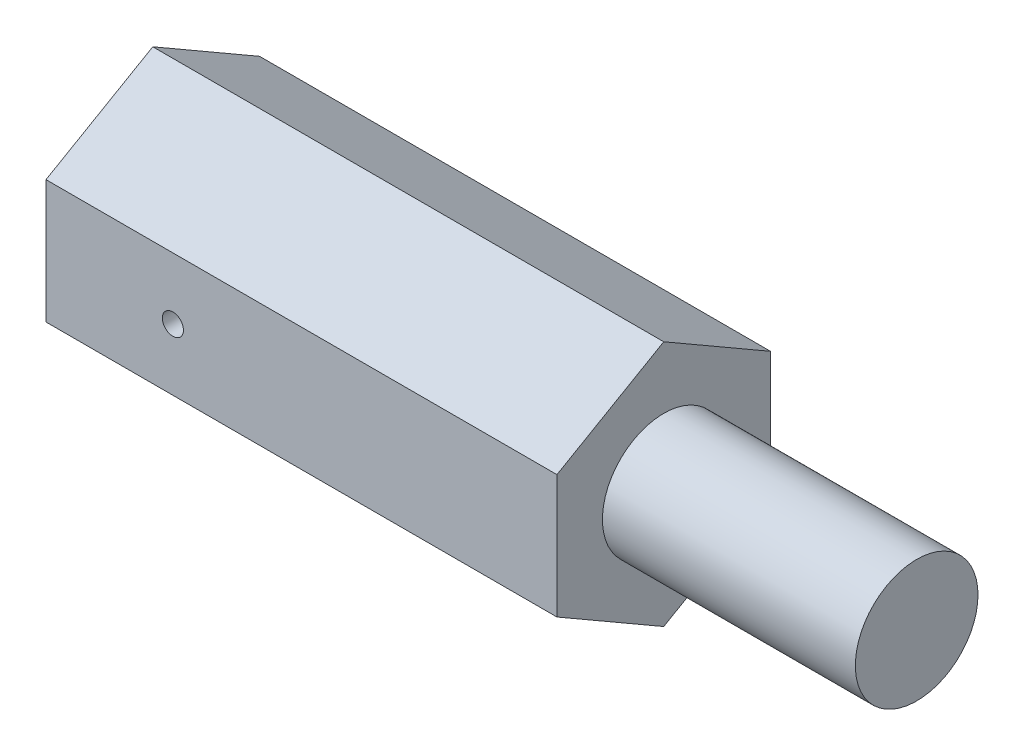
ISO-10303-21;
HEADER;
FILE_DESCRIPTION(('STEP AP214'),'2;1');
FILE_NAME('part.step','',(''),(''),'','','');
FILE_SCHEMA(('AUTOMOTIVE_DESIGN { 1 0 10303 214 1 1 1 1 }'));
ENDSEC;
DATA;
#1=APPLICATION_CONTEXT('core data for automotive mechanical design processes');
#2=APPLICATION_PROTOCOL_DEFINITION('international standard','automotive_design',2000,#1);
#3=PRODUCT_CONTEXT('',#1,'mechanical');
#4=PRODUCT('Part','Part','',(#3));
#5=PRODUCT_RELATED_PRODUCT_CATEGORY('part','',(#4));
#6=PRODUCT_DEFINITION_FORMATION('','',#4);
#7=PRODUCT_DEFINITION_CONTEXT('part definition',#1,'design');
#8=PRODUCT_DEFINITION('design','',#6,#7);
#9=PRODUCT_DEFINITION_SHAPE('','',#8);
#10=(LENGTH_UNIT() NAMED_UNIT(*) SI_UNIT(.MILLI.,.METRE.));
#11=(NAMED_UNIT(*) PLANE_ANGLE_UNIT() SI_UNIT($,.RADIAN.));
#12=(NAMED_UNIT(*) SI_UNIT($,.STERADIAN.) SOLID_ANGLE_UNIT());
#13=UNCERTAINTY_MEASURE_WITH_UNIT(LENGTH_MEASURE(1.E-05),#10,'distance_accuracy_value','');
#14=(GEOMETRIC_REPRESENTATION_CONTEXT(3) GLOBAL_UNCERTAINTY_ASSIGNED_CONTEXT((#13)) GLOBAL_UNIT_ASSIGNED_CONTEXT((#10,
#11,#12)) REPRESENTATION_CONTEXT('',''));
#15=CARTESIAN_POINT('',(0.,0.,0.));
#16=DIRECTION('',(0.,0.,1.));
#17=DIRECTION('',(1.,0.,0.));
#18=AXIS2_PLACEMENT_3D('',#15,#16,#17);
#19=CARTESIAN_POINT('',(0.,0.,0.));
#20=DIRECTION('',(1.,0.,0.));
#21=DIRECTION('',(0.,0.,-1.));
#22=AXIS2_PLACEMENT_3D('',#19,#20,#21);
#23=PLANE('',#22);
#24=DIRECTION('',(0.,0.5,0.866025403784439));
#25=VECTOR('',#24,1.);
#26=CARTESIAN_POINT('',(0.,1.45780942970381,-2.52499999999999));
#27=LINE('',#26,#25);
#28=CARTESIAN_POINT('',(0.,1.45780942970381,-2.52499999999999));
#29=VERTEX_POINT('',#28);
#30=CARTESIAN_POINT('',(0.,2.91561885940761,0.));
#31=VERTEX_POINT('',#30);
#32=EDGE_CURVE('E126',#29,#31,#27,.T.);
#33=ORIENTED_EDGE('',*,*,#32,.F.);
#34=DIRECTION('',(0.,1.,0.));
#35=VECTOR('',#34,1.);
#36=CARTESIAN_POINT('',(0.,-1.45780942970381,-2.52499999999999));
#37=LINE('',#36,#35);
#38=CARTESIAN_POINT('',(0.,-1.45780942970381,-2.52499999999999));
#39=VERTEX_POINT('',#38);
#40=EDGE_CURVE('E85',#39,#29,#37,.T.);
#41=ORIENTED_EDGE('',*,*,#40,.F.);
#42=DIRECTION('',(0.,0.5,-0.866025403784439));
#43=VECTOR('',#42,1.);
#44=CARTESIAN_POINT('',(0.,-2.91561885940762,0.));
#45=LINE('',#44,#43);
#46=CARTESIAN_POINT('',(0.,-2.91561885940762,0.));
#47=VERTEX_POINT('',#46);
#48=EDGE_CURVE('E79',#47,#39,#45,.T.);
#49=ORIENTED_EDGE('',*,*,#48,.F.);
#50=DIRECTION('',(0.,-0.5,-0.866025403784439));
#51=VECTOR('',#50,1.);
#52=CARTESIAN_POINT('',(0.,-1.45780942970381,2.52500000000001));
#53=LINE('',#52,#51);
#54=CARTESIAN_POINT('',(0.,-1.45780942970381,2.52500000000001));
#55=VERTEX_POINT('',#54);
#56=EDGE_CURVE('E116',#55,#47,#53,.T.);
#57=ORIENTED_EDGE('',*,*,#56,.F.);
#58=DIRECTION('',(0.,-1.,0.));
#59=VECTOR('',#58,1.);
#60=CARTESIAN_POINT('',(0.,1.4578094297038,2.52500000000001));
#61=LINE('',#60,#59);
#62=CARTESIAN_POINT('',(0.,1.4578094297038,2.52500000000001));
#63=VERTEX_POINT('',#62);
#64=EDGE_CURVE('E132',#63,#55,#61,.T.);
#65=ORIENTED_EDGE('',*,*,#64,.F.);
#66=DIRECTION('',(0.,-0.5,0.866025403784438));
#67=VECTOR('',#66,1.);
#68=CARTESIAN_POINT('',(0.,2.91561885940761,0.));
#69=LINE('',#68,#67);
#70=EDGE_CURVE('E129',#31,#63,#69,.T.);
#71=ORIENTED_EDGE('',*,*,#70,.F.);
#72=EDGE_LOOP('',(#33,#41,#49,#57,#65,#71));
#73=FACE_BOUND('',#72,.T.);
#74=CARTESIAN_POINT('',(0.,0.,0.));
#75=DIRECTION('',(-1.,0.,0.));
#76=DIRECTION('',(0.,0.,1.));
#77=AXIS2_PLACEMENT_3D('',#74,#75,#76);
#78=CIRCLE('',#77,2.);
#79=CARTESIAN_POINT('',(0.,0.,2.));
#80=VERTEX_POINT('',#79);
#81=EDGE_CURVE('E209',#80,#80,#78,.T.);
#82=ORIENTED_EDGE('',*,*,#81,.F.);
#83=EDGE_LOOP('',(#82));
#84=FACE_BOUND('',#83,.T.);
#85=ADVANCED_FACE('F38',(#73,#84),#23,.F.);
#86=CARTESIAN_POINT('',(12.08,0.,0.));
#87=DIRECTION('',(1.,0.,0.));
#88=DIRECTION('',(0.,0.,-1.));
#89=AXIS2_PLACEMENT_3D('',#86,#87,#88);
#90=PLANE('',#89);
#91=DIRECTION('',(0.,0.5,0.866025403784439));
#92=VECTOR('',#91,1.);
#93=CARTESIAN_POINT('',(12.08,1.45780942970381,-2.52499999999999));
#94=LINE('',#93,#92);
#95=CARTESIAN_POINT('',(12.08,1.45780942970381,-2.52499999999999));
#96=VERTEX_POINT('',#95);
#97=CARTESIAN_POINT('',(12.08,2.91561885940761,0.));
#98=VERTEX_POINT('',#97);
#99=EDGE_CURVE('E137',#96,#98,#94,.T.);
#100=ORIENTED_EDGE('',*,*,#99,.T.);
#101=DIRECTION('',(0.,-0.5,0.866025403784438));
#102=VECTOR('',#101,1.);
#103=CARTESIAN_POINT('',(12.08,2.91561885940761,0.));
#104=LINE('',#103,#102);
#105=CARTESIAN_POINT('',(12.08,1.4578094297038,2.52500000000001));
#106=VERTEX_POINT('',#105);
#107=EDGE_CURVE('E93',#98,#106,#104,.T.);
#108=ORIENTED_EDGE('',*,*,#107,.T.);
#109=DIRECTION('',(0.,-1.,0.));
#110=VECTOR('',#109,1.);
#111=CARTESIAN_POINT('',(12.08,1.4578094297038,2.52500000000001));
#112=LINE('',#111,#110);
#113=CARTESIAN_POINT('',(12.08,-1.45780942970381,2.52500000000001));
#114=VERTEX_POINT('',#113);
#115=EDGE_CURVE('E108',#106,#114,#112,.T.);
#116=ORIENTED_EDGE('',*,*,#115,.T.);
#117=DIRECTION('',(0.,-0.5,-0.866025403784439));
#118=VECTOR('',#117,1.);
#119=CARTESIAN_POINT('',(12.08,-1.45780942970381,2.52500000000001));
#120=LINE('',#119,#118);
#121=CARTESIAN_POINT('',(12.08,-2.91561885940762,0.));
#122=VERTEX_POINT('',#121);
#123=EDGE_CURVE('E101',#114,#122,#120,.T.);
#124=ORIENTED_EDGE('',*,*,#123,.T.);
#125=DIRECTION('',(0.,0.5,-0.866025403784439));
#126=VECTOR('',#125,1.);
#127=CARTESIAN_POINT('',(12.08,-2.91561885940762,0.));
#128=LINE('',#127,#126);
#129=CARTESIAN_POINT('',(12.08,-1.45780942970381,-2.52499999999999));
#130=VERTEX_POINT('',#129);
#131=EDGE_CURVE('E106',#122,#130,#128,.T.);
#132=ORIENTED_EDGE('',*,*,#131,.T.);
#133=DIRECTION('',(0.,1.,0.));
#134=VECTOR('',#133,1.);
#135=CARTESIAN_POINT('',(12.08,-1.45780942970381,-2.52499999999999));
#136=LINE('',#135,#134);
#137=EDGE_CURVE('E55',#130,#96,#136,.T.);
#138=ORIENTED_EDGE('',*,*,#137,.T.);
#139=EDGE_LOOP('',(#100,#108,#116,#124,#132,#138));
#140=FACE_BOUND('',#139,.T.);
#141=CARTESIAN_POINT('',(12.08,0.,0.));
#142=DIRECTION('',(1.,0.,0.));
#143=DIRECTION('',(0.,0.,-1.));
#144=AXIS2_PLACEMENT_3D('',#141,#142,#143);
#145=CIRCLE('',#144,1.45);
#146=CARTESIAN_POINT('',(12.08,0.,-1.45));
#147=VERTEX_POINT('',#146);
#148=EDGE_CURVE('E218',#147,#147,#145,.T.);
#149=ORIENTED_EDGE('',*,*,#148,.F.);
#150=EDGE_LOOP('',(#149));
#151=FACE_BOUND('',#150,.T.);
#152=ADVANCED_FACE('F103',(#140,#151),#90,.T.);
#153=CARTESIAN_POINT('',(12.08,1.45780942970381,-2.52499999999999));
#154=DIRECTION('',(0.,-0.866025403784439,0.5));
#155=DIRECTION('',(0.,-0.5,-0.866025403784439));
#156=AXIS2_PLACEMENT_3D('',#153,#154,#155);
#157=PLANE('',#156);
#158=ORIENTED_EDGE('',*,*,#32,.T.);
#159=DIRECTION('',(-1.,0.,0.));
#160=VECTOR('',#159,1.);
#161=CARTESIAN_POINT('',(12.08,2.91561885940761,0.));
#162=LINE('',#161,#160);
#163=EDGE_CURVE('E11',#98,#31,#162,.T.);
#164=ORIENTED_EDGE('',*,*,#163,.F.);
#165=ORIENTED_EDGE('',*,*,#99,.F.);
#166=DIRECTION('',(-1.,0.,0.));
#167=VECTOR('',#166,1.);
#168=CARTESIAN_POINT('',(12.08,1.45780942970381,-2.52499999999999));
#169=LINE('',#168,#167);
#170=EDGE_CURVE('E122',#96,#29,#169,.T.);
#171=ORIENTED_EDGE('',*,*,#170,.T.);
#172=EDGE_LOOP('',(#158,#164,#165,#171));
#173=FACE_BOUND('',#172,.T.);
#174=ADVANCED_FACE('F40',(#173),#157,.F.);
#175=CARTESIAN_POINT('',(12.08,2.91561885940761,0.));
#176=DIRECTION('',(0.,-0.866025403784438,-0.5));
#177=DIRECTION('',(0.,0.5,-0.866025403784438));
#178=AXIS2_PLACEMENT_3D('',#175,#176,#177);
#179=PLANE('',#178);
#180=ORIENTED_EDGE('',*,*,#70,.T.);
#181=DIRECTION('',(-1.,0.,0.));
#182=VECTOR('',#181,1.);
#183=CARTESIAN_POINT('',(12.08,1.4578094297038,2.52500000000001));
#184=LINE('',#183,#182);
#185=EDGE_CURVE('E47',#106,#63,#184,.T.);
#186=ORIENTED_EDGE('',*,*,#185,.F.);
#187=ORIENTED_EDGE('',*,*,#107,.F.);
#188=ORIENTED_EDGE('',*,*,#163,.T.);
#189=EDGE_LOOP('',(#180,#186,#187,#188));
#190=FACE_BOUND('',#189,.T.);
#191=ADVANCED_FACE('F238',(#190),#179,.F.);
#192=CARTESIAN_POINT('',(12.08,1.4578094297038,2.52500000000001));
#193=DIRECTION('',(0.,0.,-1.));
#194=DIRECTION('',(-1.,0.,0.));
#195=AXIS2_PLACEMENT_3D('',#192,#193,#194);
#196=PLANE('',#195);
#197=CARTESIAN_POINT('',(3.,0.,2.52500000000001));
#198=DIRECTION('',(0.,0.,1.));
#199=DIRECTION('',(1.,0.,0.));
#200=AXIS2_PLACEMENT_3D('',#197,#198,#199);
#201=CIRCLE('',#200,0.25);
#202=CARTESIAN_POINT('',(3.25,0.,2.52500000000001));
#203=VERTEX_POINT('',#202);
#204=EDGE_CURVE('E201',#203,#203,#201,.T.);
#205=ORIENTED_EDGE('',*,*,#204,.F.);
#206=EDGE_LOOP('',(#205));
#207=FACE_BOUND('',#206,.T.);
#208=ORIENTED_EDGE('',*,*,#64,.T.);
#209=DIRECTION('',(-1.,0.,0.));
#210=VECTOR('',#209,1.);
#211=CARTESIAN_POINT('',(12.08,-1.45780942970381,2.52500000000001));
#212=LINE('',#211,#210);
#213=EDGE_CURVE('E117',#114,#55,#212,.T.);
#214=ORIENTED_EDGE('',*,*,#213,.F.);
#215=ORIENTED_EDGE('',*,*,#115,.F.);
#216=ORIENTED_EDGE('',*,*,#185,.T.);
#217=EDGE_LOOP('',(#208,#214,#215,#216));
#218=FACE_BOUND('',#217,.T.);
#219=ADVANCED_FACE('F143',(#207,#218),#196,.F.);
#220=CARTESIAN_POINT('',(12.08,-1.45780942970381,2.52500000000001));
#221=DIRECTION('',(0.,0.866025403784439,-0.5));
#222=DIRECTION('',(0.,0.5,0.866025403784439));
#223=AXIS2_PLACEMENT_3D('',#220,#221,#222);
#224=PLANE('',#223);
#225=ORIENTED_EDGE('',*,*,#56,.T.);
#226=DIRECTION('',(-1.,0.,0.));
#227=VECTOR('',#226,1.);
#228=CARTESIAN_POINT('',(12.08,-2.91561885940762,0.));
#229=LINE('',#228,#227);
#230=EDGE_CURVE('E113',#122,#47,#229,.T.);
#231=ORIENTED_EDGE('',*,*,#230,.F.);
#232=ORIENTED_EDGE('',*,*,#123,.F.);
#233=ORIENTED_EDGE('',*,*,#213,.T.);
#234=EDGE_LOOP('',(#225,#231,#232,#233));
#235=FACE_BOUND('',#234,.T.);
#236=ADVANCED_FACE('F114',(#235),#224,.F.);
#237=CARTESIAN_POINT('',(12.08,-2.91561885940762,0.));
#238=DIRECTION('',(0.,0.866025403784439,0.5));
#239=DIRECTION('',(0.,-0.5,0.866025403784439));
#240=AXIS2_PLACEMENT_3D('',#237,#238,#239);
#241=PLANE('',#240);
#242=ORIENTED_EDGE('',*,*,#48,.T.);
#243=DIRECTION('',(-1.,0.,0.));
#244=VECTOR('',#243,1.);
#245=CARTESIAN_POINT('',(12.08,-1.45780942970381,-2.52499999999999));
#246=LINE('',#245,#244);
#247=EDGE_CURVE('E118',#130,#39,#246,.T.);
#248=ORIENTED_EDGE('',*,*,#247,.F.);
#249=ORIENTED_EDGE('',*,*,#131,.F.);
#250=ORIENTED_EDGE('',*,*,#230,.T.);
#251=EDGE_LOOP('',(#242,#248,#249,#250));
#252=FACE_BOUND('',#251,.T.);
#253=ADVANCED_FACE('F120',(#252),#241,.F.);
#254=CARTESIAN_POINT('',(12.08,-1.45780942970381,-2.52499999999999));
#255=DIRECTION('',(0.,0.,1.));
#256=DIRECTION('',(0.,-1.,0.));
#257=AXIS2_PLACEMENT_3D('',#254,#255,#256);
#258=PLANE('',#257);
#259=CARTESIAN_POINT('',(3.,0.,-2.52499999999999));
#260=DIRECTION('',(0.,0.,-1.));
#261=DIRECTION('',(0.,1.,0.));
#262=AXIS2_PLACEMENT_3D('',#259,#260,#261);
#263=CIRCLE('',#262,1.);
#264=CARTESIAN_POINT('',(3.,1.00000000000001,-2.52499999999999));
#265=VERTEX_POINT('',#264);
#266=EDGE_CURVE('E327',#265,#265,#263,.T.);
#267=ORIENTED_EDGE('',*,*,#266,.F.);
#268=EDGE_LOOP('',(#267));
#269=FACE_BOUND('',#268,.T.);
#270=ORIENTED_EDGE('',*,*,#40,.T.);
#271=ORIENTED_EDGE('',*,*,#170,.F.);
#272=ORIENTED_EDGE('',*,*,#137,.F.);
#273=ORIENTED_EDGE('',*,*,#247,.T.);
#274=EDGE_LOOP('',(#270,#271,#272,#273));
#275=FACE_BOUND('',#274,.T.);
#276=ADVANCED_FACE('F150',(#269,#275),#258,.F.);
#277=CARTESIAN_POINT('',(18.06,0.,0.));
#278=DIRECTION('',(-1.,0.,0.));
#279=DIRECTION('',(0.,0.,1.));
#280=AXIS2_PLACEMENT_3D('',#277,#278,#279);
#281=CYLINDRICAL_SURFACE('',#280,1.45);
#282=CARTESIAN_POINT('',(18.06,0.,0.));
#283=DIRECTION('',(1.,0.,0.));
#284=DIRECTION('',(0.,0.,-1.));
#285=AXIS2_PLACEMENT_3D('',#282,#283,#284);
#286=CIRCLE('',#285,1.45);
#287=CARTESIAN_POINT('',(18.06,0.,-1.45));
#288=VERTEX_POINT('',#287);
#289=EDGE_CURVE('E130',#288,#288,#286,.T.);
#290=ORIENTED_EDGE('',*,*,#289,.F.);
#291=EDGE_LOOP('',(#290));
#292=FACE_BOUND('',#291,.T.);
#293=ORIENTED_EDGE('',*,*,#148,.T.);
#294=EDGE_LOOP('',(#293));
#295=FACE_BOUND('',#294,.T.);
#296=ADVANCED_FACE('F152',(#292,#295),#281,.T.);
#297=CARTESIAN_POINT('',(18.06,0.,0.));
#298=DIRECTION('',(1.,0.,0.));
#299=DIRECTION('',(0.,0.,-1.));
#300=AXIS2_PLACEMENT_3D('',#297,#298,#299);
#301=PLANE('',#300);
#302=ORIENTED_EDGE('',*,*,#289,.T.);
#303=EDGE_LOOP('',(#302));
#304=FACE_BOUND('',#303,.T.);
#305=ADVANCED_FACE('F159',(#304),#301,.T.);
#306=CARTESIAN_POINT('',(7.99999999999999,0.,0.));
#307=DIRECTION('',(-1.,0.,0.));
#308=DIRECTION('',(0.,0.,1.));
#309=AXIS2_PLACEMENT_3D('',#306,#307,#308);
#310=CONICAL_SURFACE('',#309,1.24999999999999,1.02974425867665);
#311=CARTESIAN_POINT('',(8.75107577378444,0.,0.));
#312=VERTEX_POINT('',#311);
#313=VERTEX_LOOP('',#312);
#314=FACE_BOUND('',#313,.T.);
#315=CARTESIAN_POINT('',(7.99999999999999,0.,0.));
#316=DIRECTION('',(-1.,0.,0.));
#317=DIRECTION('',(0.,0.,1.));
#318=AXIS2_PLACEMENT_3D('',#315,#316,#317);
#319=CIRCLE('',#318,1.24999999999999);
#320=CARTESIAN_POINT('',(7.99999999999999,0.,1.24999999999999));
#321=VERTEX_POINT('',#320);
#322=EDGE_CURVE('E215',#321,#321,#319,.T.);
#323=ORIENTED_EDGE('',*,*,#322,.T.);
#324=EDGE_LOOP('',(#323));
#325=FACE_BOUND('',#324,.T.);
#326=ADVANCED_FACE('F173',(#314,#325),#310,.F.);
#327=CARTESIAN_POINT('',(0.,0.,0.));
#328=DIRECTION('',(-1.,0.,0.));
#329=DIRECTION('',(0.,0.,1.));
#330=AXIS2_PLACEMENT_3D('',#327,#328,#329);
#331=CYLINDRICAL_SURFACE('',#330,1.24999999999999);
#332=CARTESIAN_POINT('',(3.,1.,-0.749999999999982));
#333=CARTESIAN_POINT('',(2.96245949130572,0.999994978192103,-0.750011378799533));
#334=CARTESIAN_POINT('',(2.92486053695319,0.997861215074799,-0.752877943380066));
#335=CARTESIAN_POINT('',(2.85084273528519,0.989521752173195,-0.763798985491492));
#336=CARTESIAN_POINT('',(2.81442838909394,0.983302079694617,-0.7718712633973));
#337=CARTESIAN_POINT('',(2.73119729024573,0.964441445062304,-0.795391568821988));
#338=CARTESIAN_POINT('',(2.68517874645023,0.950317939263925,-0.812429747211955));
#339=CARTESIAN_POINT('',(2.59701592991936,0.916432064561178,-0.850472665064197));
#340=CARTESIAN_POINT('',(2.55488302516643,0.89665380341871,-0.87148852641521));
#341=CARTESIAN_POINT('',(2.45983017160975,0.84388878306087,-0.923124833296875));
#342=CARTESIAN_POINT('',(2.40851671293636,0.80871181855881,-0.954470940574631));
#343=CARTESIAN_POINT('',(2.31301158239389,0.729309675323705,-1.0164399837395));
#344=CARTESIAN_POINT('',(2.26881402894305,0.685092038411011,-1.04706349882234));
#345=CARTESIAN_POINT('',(2.19644754021127,0.597380131394039,-1.09895337197254));
#346=CARTESIAN_POINT('',(2.16683685865797,0.555466880733453,-1.12087340394003));
#347=CARTESIAN_POINT('',(2.11381702001685,0.46622237775379,-1.16082576261632));
#348=CARTESIAN_POINT('',(2.09039822589956,0.418899711047486,-1.17886412250182));
#349=CARTESIAN_POINT('',(2.05414351970967,0.32765854111128,-1.20707822348189));
#350=CARTESIAN_POINT('',(2.04020871771195,0.284426792877848,-1.21805368045697));
#351=CARTESIAN_POINT('',(2.018250652373,0.195594026461011,-1.23542956142487));
#352=CARTESIAN_POINT('',(2.01022415604496,0.149994318656346,-1.24183248741985));
#353=CARTESIAN_POINT('',(2.00057095335495,0.0575241675682457,-1.24953984441815));
#354=CARTESIAN_POINT('',(1.99896640365576,0.010649885686261,-1.25082662386095));
#355=CARTESIAN_POINT('',(2.00233211743601,-0.0827081832139646,-1.24813468072352));
#356=CARTESIAN_POINT('',(2.00730268518398,-0.129191952060744,-1.24415571446693));
#357=CARTESIAN_POINT('',(2.0230339931568,-0.217841784218386,-1.2316418285683));
#358=CARTESIAN_POINT('',(2.03346440847905,-0.260105094459996,-1.22336702428918));
#359=CARTESIAN_POINT('',(2.0593476171251,-0.34208593108495,-1.20302246829963));
#360=CARTESIAN_POINT('',(2.07480167774501,-0.381802812060201,-1.19095175903561));
#361=CARTESIAN_POINT('',(2.11180034929839,-0.461763659122334,-1.16243110999745));
#362=CARTESIAN_POINT('',(2.13378825802348,-0.501689846486499,-1.1456713283535));
#363=CARTESIAN_POINT('',(2.1822689297797,-0.577354456791678,-1.10947021818014));
#364=CARTESIAN_POINT('',(2.2087642146211,-0.613090516407488,-1.09002738968188));
#365=CARTESIAN_POINT('',(2.2715309344757,-0.68713260687481,-1.04526755513478));
#366=CARTESIAN_POINT('',(2.30869180740791,-0.724450544069197,-1.01956572241199));
#367=CARTESIAN_POINT('',(2.3881279521317,-0.792691925345945,-0.967461890596498));
#368=CARTESIAN_POINT('',(2.43040943941428,-0.823607472276003,-0.941059071592921));
#369=CARTESIAN_POINT('',(2.51561009783751,-0.876142642366372,-0.892206587909589));
#370=CARTESIAN_POINT('',(2.55807547023795,-0.898370869956541,-0.86962112271012));
#371=CARTESIAN_POINT('',(2.64718323318611,-0.936945534963016,-0.827910528924781));
#372=CARTESIAN_POINT('',(2.69381621017302,-0.953304829369341,-0.808777882596542));
#373=CARTESIAN_POINT('',(2.77639580201094,-0.975310998676268,-0.781969025707477));
#374=CARTESIAN_POINT('',(2.81130641544816,-0.982701468572952,-0.772578009774829));
#375=CARTESIAN_POINT('',(2.88259010297785,-0.993734890612833,-0.758336523407938));
#376=CARTESIAN_POINT('',(2.91895972695553,-0.997386197900179,-0.753475931952516));
#377=CARTESIAN_POINT('',(2.99243168896347,-1.00064997213184,-0.749138951468879));
#378=CARTESIAN_POINT('',(3.02953704252866,-1.00023903132121,-0.749693767227678));
#379=CARTESIAN_POINT('',(3.10302366251876,-0.995363051305353,-0.756152280928933));
#380=CARTESIAN_POINT('',(3.13940383319374,-0.99089229166051,-0.76206352625987));
#381=CARTESIAN_POINT('',(3.21953160133088,-0.976657152245989,-0.780257542153792));
#382=CARTESIAN_POINT('',(3.26279913406541,-0.965835464454391,-0.793778607431114));
#383=CARTESIAN_POINT('',(3.34614543304273,-0.939206942252631,-0.825114046699047));
#384=CARTESIAN_POINT('',(3.38621424045154,-0.923385245336583,-0.842941182745446));
#385=CARTESIAN_POINT('',(3.48076446467464,-0.879038044599076,-0.889516249969426));
#386=CARTESIAN_POINT('',(3.53344766716257,-0.848012554724654,-0.919527821737605));
#387=CARTESIAN_POINT('',(3.632192074621,-0.777190197823291,-0.980134265788408));
#388=CARTESIAN_POINT('',(3.67824537984172,-0.737383007736811,-1.01072978552214));
#389=CARTESIAN_POINT('',(3.76373140367251,-0.648511520537709,-1.06996649629578));
#390=CARTESIAN_POINT('',(3.80306131455653,-0.59932430261482,-1.09857394129829));
#391=CARTESIAN_POINT('',(3.87263326372209,-0.492485138870666,-1.15041523144686));
#392=CARTESIAN_POINT('',(3.90290480283531,-0.434861601727602,-1.17366646220319));
#393=CARTESIAN_POINT('',(3.94424529373344,-0.332265997070493,-1.2058158093024));
#394=CARTESIAN_POINT('',(3.95835868848705,-0.289204132561675,-1.21692460774942));
#395=CARTESIAN_POINT('',(3.98071606748198,-0.200682690617823,-1.23460775195756));
#396=CARTESIAN_POINT('',(3.98896453227031,-0.155224972089537,-1.24118555907535));
#397=CARTESIAN_POINT('',(3.99909641205235,-0.0629806790261592,-1.24927349861996));
#398=CARTESIAN_POINT('',(4.00095660252915,-0.0161898780727319,-1.25076514019579));
#399=CARTESIAN_POINT('',(3.99811674536739,0.0770647474857701,-1.2484935999668));
#400=CARTESIAN_POINT('',(3.99341623579585,0.123528548835588,-1.24473004814855));
#401=CARTESIAN_POINT('',(3.97819822645439,0.212242491653917,-1.23262004202547));
#402=CARTESIAN_POINT('',(3.96800533429858,0.254585079550802,-1.2245295015305));
#403=CARTESIAN_POINT('',(3.94257328934327,0.336760271178367,-1.20452600981505));
#404=CARTESIAN_POINT('',(3.92733282958699,0.376592221651758,-1.19261206863374));
#405=CARTESIAN_POINT('',(3.89081272780373,0.45669179592593,-1.16443101603606));
#406=CARTESIAN_POINT('',(3.86910307894451,0.496655044076982,-1.14786198501045));
#407=CARTESIAN_POINT('',(3.82117883145269,0.572431980631523,-1.11201698004796));
#408=CARTESIAN_POINT('',(3.79496184096576,0.608243448881537,-1.09273956988757));
#409=CARTESIAN_POINT('',(3.73285189349816,0.682441119976983,-1.04833426214934));
#410=CARTESIAN_POINT('',(3.6960767933423,0.719854018968198,-1.02281649584996));
#411=CARTESIAN_POINT('',(3.61744153723831,0.788346765399948,-0.971006564600291));
#412=CARTESIAN_POINT('',(3.57557508619734,0.819418642915263,-0.94471347205916));
#413=CARTESIAN_POINT('',(3.49052122773522,0.872756306831699,-0.895545626609046));
#414=CARTESIAN_POINT('',(3.44771373939198,0.895530700323293,-0.872566315087728));
#415=CARTESIAN_POINT('',(3.35780405587433,0.935081523426155,-0.830037249515682));
#416=CARTESIAN_POINT('',(3.31071011098114,0.951869181798226,-0.810481110408639));
#417=CARTESIAN_POINT('',(3.22693033662368,0.974570699612193,-0.782900509705676));
#418=CARTESIAN_POINT('',(3.19129022779641,0.982232354244819,-0.773176103143652));
#419=CARTESIAN_POINT('',(3.11848786451458,0.99363141311981,-0.758477361128188));
#420=CARTESIAN_POINT('',(3.08133197236104,0.99738375569947,-0.753484950334111));
#421=CARTESIAN_POINT('',(3.02933739282884,0.999678711139158,-0.750427300661993));
#422=CARTESIAN_POINT('',(3.01467316087827,1.00000196283423,-0.749995552458854));
#423=CARTESIAN_POINT('',(3.,1.,-0.749999999999982));
#424=B_SPLINE_CURVE_WITH_KNOTS('',3,(#332,#333,#334,#335,#336,#337,#338,#339,#340,#341,#342,
#343,#344,#345,#346,#347,#348,#349,#350,#351,#352,#353,#354,#355,#356,#357,#358,#359,#360,#361,
#362,#363,#364,#365,#366,#367,#368,#369,#370,#371,#372,#373,#374,#375,#376,#377,#378,#379,#380,
#381,#382,#383,#384,#385,#386,#387,#388,#389,#390,#391,#392,#393,#394,#395,#396,#397,#398,#399,
#400,#401,#402,#403,#404,#405,#406,#407,#408,#409,#410,#411,#412,#413,#414,#415,#416,#417,#418,
#419,#420,#421,#422,#423),.UNSPECIFIED.,.T.,.F.,(4,2,2,2,2,2,2,2,2,2,2,2,2,2,2,2,2,2,2,2,2,2,2,
2,2,2,2,2,2,2,2,2,2,2,2,2,2,2,2,2,2,2,2,2,2,4),(0.,0.112570409406644,0.225527796947506,
0.377857192330436,0.530618977974815,0.738604023058366,0.946416267684396,1.11319651589548,
1.27971563925512,1.41931047217589,1.5588288628047,1.69882819963964,1.83883401527604,
1.97120958750648,2.10361857957313,2.24878255344214,2.39402801313076,2.56920613274928,
2.74459905888008,2.90309596694958,3.06124350670993,3.17153863144893,3.28158676082683,
3.39226938477202,3.50310820715854,3.64214280191072,3.78159462651181,3.98487905990308,
4.1884037436676,4.39480587476551,4.60052830132396,4.7399296380905,4.87922436364601,
5.01902496096861,5.15883540202154,5.29116720994034,5.42353330909756,5.56821679423486,
5.71297729506444,5.88736759531388,6.06197575191445,6.22247870462829,6.38267901367552,
6.49545691635984,6.60780227147755,6.65180177454257),.UNSPECIFIED.);
#425=CARTESIAN_POINT('',(3.,1.,-0.749999999999982));
#426=VERTEX_POINT('',#425);
#427=EDGE_CURVE('E202',#426,#426,#424,.T.);
#428=ORIENTED_EDGE('',*,*,#427,.F.);
#429=EDGE_LOOP('',(#428));
#430=FACE_BOUND('',#429,.T.);
#431=CARTESIAN_POINT('',(3.25,0.,1.24999999999999));
#432=CARTESIAN_POINT('',(3.24999948887541,-0.0138942266981583,1.24999974395217));
#433=CARTESIAN_POINT('',(3.24883778925809,-0.0277949150503806,1.24976596294557));
#434=CARTESIAN_POINT('',(3.24422537497119,-0.0552033769222549,1.24885591405807));
#435=CARTESIAN_POINT('',(3.24077284179962,-0.068710829385339,1.24817929465046));
#436=CARTESIAN_POINT('',(3.2316896815948,-0.0949325763158283,1.24645912319571));
#437=CARTESIAN_POINT('',(3.22606114078883,-0.107647616983284,1.24541592269179));
#438=CARTESIAN_POINT('',(3.21279193812218,-0.131951997216056,1.24307599508828));
#439=CARTESIAN_POINT('',(3.2051513960982,-0.143541403768953,1.24177928308926));
#440=CARTESIAN_POINT('',(3.18796537642714,-0.165423369328716,1.23905541332492));
#441=CARTESIAN_POINT('',(3.1783979111522,-0.175698487789631,1.23762686376086));
#442=CARTESIAN_POINT('',(3.15767689590208,-0.194509189152007,1.23481045113146));
#443=CARTESIAN_POINT('',(3.14652322216622,-0.203044636192606,1.23342259125105));
#444=CARTESIAN_POINT('',(3.12282095174703,-0.218207938336905,1.23083110453153));
#445=CARTESIAN_POINT('',(3.11026058905091,-0.224817734716467,1.22962926841236));
#446=CARTESIAN_POINT('',(3.08417954524898,-0.235826416645077,1.22756567014604));
#447=CARTESIAN_POINT('',(3.07065895916341,-0.24022552060931,1.2267038744049));
#448=CARTESIAN_POINT('',(3.04322890902302,-0.246631324971207,1.2254320131305));
#449=CARTESIAN_POINT('',(3.02932686396444,-0.248668624489695,1.22501617526796));
#450=CARTESIAN_POINT('',(3.00137254465891,-0.25038803193153,1.22466593765156));
#451=CARTESIAN_POINT('',(2.98732028591996,-0.250070380678375,1.22473148866959));
#452=CARTESIAN_POINT('',(2.95968830299475,-0.247113643275455,1.22533137787045));
#453=CARTESIAN_POINT('',(2.94610464859317,-0.244509635060977,1.2258586321469));
#454=CARTESIAN_POINT('',(2.91957098083425,-0.237109471155763,1.2273113654));
#455=CARTESIAN_POINT('',(2.90662099777025,-0.232313210775171,1.22823686339444));
#456=CARTESIAN_POINT('',(2.8816211845741,-0.22063119591868,1.23038904625101));
#457=CARTESIAN_POINT('',(2.86957803010771,-0.213731537808029,1.23161772453425));
#458=CARTESIAN_POINT('',(2.8468072875068,-0.19804839364317,1.23423654693265));
#459=CARTESIAN_POINT('',(2.83607985078721,-0.189264691089208,1.23562670959591));
#460=CARTESIAN_POINT('',(2.81604264938577,-0.169874983640146,1.23844255310365));
#461=CARTESIAN_POINT('',(2.80676185803522,-0.159239040303111,1.23986842302725));
#462=CARTESIAN_POINT('',(2.79011153842469,-0.136546256015503,1.24257212178601));
#463=CARTESIAN_POINT('',(2.78274203467661,-0.124489396844848,1.24384994872243));
#464=CARTESIAN_POINT('',(2.77011812269351,-0.0992648467197305,1.24611672540221));
#465=CARTESIAN_POINT('',(2.76486702658887,-0.0860954548963253,1.24710522212067));
#466=CARTESIAN_POINT('',(2.75665988149036,-0.0590372441121665,1.24867852246964));
#467=CARTESIAN_POINT('',(2.75370355448159,-0.0451485125181126,1.24926337500132));
#468=CARTESIAN_POINT('',(2.75021088655143,-0.0172948514067878,1.24995667966716));
#469=CARTESIAN_POINT('',(2.74963489511493,-0.00333508208139429,1.25007293663117));
#470=CARTESIAN_POINT('',(2.75081246473554,0.0244812335481783,1.24983762982525));
#471=CARTESIAN_POINT('',(2.75256589483815,0.0383377856109481,1.24948609235361));
#472=CARTESIAN_POINT('',(2.75831959338599,0.0654264149866351,1.24835958002004));
#473=CARTESIAN_POINT('',(2.76229951712448,0.0786629870849757,1.24758844101051));
#474=CARTESIAN_POINT('',(2.77237099566395,0.104280906874917,1.24570888015257));
#475=CARTESIAN_POINT('',(2.77846270866921,0.116662190409385,1.24460043303556));
#476=CARTESIAN_POINT('',(2.79267062266283,0.140385293421554,1.24214977883323));
#477=CARTESIAN_POINT('',(2.80081069525974,0.151712531688047,1.24080487609262));
#478=CARTESIAN_POINT('',(2.81885229780182,0.172854504779802,1.2380368370747));
#479=CARTESIAN_POINT('',(2.82875401659997,0.182669077232691,1.23661369242096));
#480=CARTESIAN_POINT('',(2.85021833797278,0.200660147693544,1.23382325889241));
#481=CARTESIAN_POINT('',(2.86180393605533,0.208809425612164,1.23245715058325));
#482=CARTESIAN_POINT('',(2.88620284033917,0.223046355012802,1.22996047949048));
#483=CARTESIAN_POINT('',(2.89901609739339,0.229134088980726,1.22882990728335));
#484=CARTESIAN_POINT('',(2.92544206153739,0.23903796039549,1.22694185146095));
#485=CARTESIAN_POINT('',(2.93905021030258,0.242865874947763,1.22618243718046));
#486=CARTESIAN_POINT('',(2.96673336337273,0.248177162906799,1.22511859198006));
#487=CARTESIAN_POINT('',(2.98080830655234,0.249660842056278,1.22481410172777));
#488=CARTESIAN_POINT('',(3.00875221613608,0.250230227716867,1.22469787407844));
#489=CARTESIAN_POINT('',(3.02262028723175,0.249358947017724,1.22487729797324));
#490=CARTESIAN_POINT('',(3.05000791247626,0.245338076025016,1.22568893371153));
#491=CARTESIAN_POINT('',(3.0635274694237,0.242188504032325,1.22632114191792));
#492=CARTESIAN_POINT('',(3.08980692781014,0.233719642124739,1.22796316054789));
#493=CARTESIAN_POINT('',(3.1025685901256,0.228405626679337,1.22897205254707));
#494=CARTESIAN_POINT('',(3.12702593018361,0.215763661150402,1.23125428743542));
#495=CARTESIAN_POINT('',(3.13872151843128,0.208435542193721,1.23252765249723));
#496=CARTESIAN_POINT('',(3.16092889303758,0.191826478696604,1.23522240130806));
#497=CARTESIAN_POINT('',(3.1714171913169,0.182514471808795,1.23664593227424));
#498=CARTESIAN_POINT('',(3.19069655138229,0.162266092253285,1.23946520467988));
#499=CARTESIAN_POINT('',(3.19948722257932,0.151329346788334,1.24086093965795));
#500=CARTESIAN_POINT('',(3.21520866098661,0.128004407272062,1.24348458096992));
#501=CARTESIAN_POINT('',(3.22211900082001,0.115602221107459,1.24471057804811));
#502=CARTESIAN_POINT('',(3.23374653064915,0.0897915902351832,1.24683781271249));
#503=CARTESIAN_POINT('',(3.23846569738312,0.0763840652157817,1.24773934284653));
#504=CARTESIAN_POINT('',(3.24466298701118,0.0524553722309451,1.24894093148842));
#505=CARTESIAN_POINT('',(3.24666079842694,0.0420704160034464,1.24933575789612));
#506=CARTESIAN_POINT('',(3.24932947808959,0.0211248813025169,1.24986538534972));
#507=CARTESIAN_POINT('',(3.25000038862744,0.0105643084371548,1.25000019468288));
#508=CARTESIAN_POINT('',(3.25,0.,1.24999999999999));
#509=B_SPLINE_CURVE_WITH_KNOTS('',3,(#431,#432,#433,#434,#435,#436,#437,#438,#439,#440,#441,
#442,#443,#444,#445,#446,#447,#448,#449,#450,#451,#452,#453,#454,#455,#456,#457,#458,#459,#460,
#461,#462,#463,#464,#465,#466,#467,#468,#469,#470,#471,#472,#473,#474,#475,#476,#477,#478,#479,
#480,#481,#482,#483,#484,#485,#486,#487,#488,#489,#490,#491,#492,#493,#494,#495,#496,#497,#498,
#499,#500,#501,#502,#503,#504,#505,#506,#507,#508),.UNSPECIFIED.,.T.,.F.,(4,2,2,2,2,2,2,2,2,2,2,
2,2,2,2,2,2,2,2,2,2,2,2,2,2,2,2,2,2,2,2,2,2,2,2,2,2,2,4),(0.,0.0416440326653146,
0.0833211626728308,0.124958433812585,0.166593225557716,0.208733167528047,0.250876399186842,
0.293402987514807,0.335925373412994,0.377890462758969,0.419851260703063,0.461179317515696,
0.502509348134325,0.544118725508982,0.585732886874177,0.628095631228378,0.670458918849552,
0.712888187135061,0.755312314245091,0.797026839190664,0.83873901914467,0.88007613487681,
0.921416348040057,0.963262665083398,1.00511347086483,1.04760157144807,1.09008797180867,
1.13235095258181,1.17460842082604,1.21609930641925,1.25758985873152,1.29897990313278,
1.34037341895467,1.38247019059786,1.42457663633233,1.4671237416891,1.5096323887938,
1.54129693822474,1.57296047842749),.UNSPECIFIED.);
#510=CARTESIAN_POINT('',(3.25,0.,1.24999999999999));
#511=VERTEX_POINT('',#510);
#512=EDGE_CURVE('E195',#511,#511,#509,.T.);
#513=ORIENTED_EDGE('',*,*,#512,.F.);
#514=EDGE_LOOP('',(#513));
#515=FACE_BOUND('',#514,.T.);
#516=ORIENTED_EDGE('',*,*,#322,.F.);
#517=EDGE_LOOP('',(#516));
#518=FACE_BOUND('',#517,.T.);
#519=CARTESIAN_POINT('',(0.75,0.,0.));
#520=DIRECTION('',(-1.,0.,0.));
#521=DIRECTION('',(0.,0.,1.));
#522=AXIS2_PLACEMENT_3D('',#519,#520,#521);
#523=CIRCLE('',#522,1.25);
#524=CARTESIAN_POINT('',(0.75,0.,1.25));
#525=VERTEX_POINT('',#524);
#526=EDGE_CURVE('E212',#525,#525,#523,.T.);
#527=ORIENTED_EDGE('',*,*,#526,.T.);
#528=EDGE_LOOP('',(#527));
#529=FACE_BOUND('',#528,.T.);
#530=ADVANCED_FACE('F177',(#430,#515,#518,#529),#331,.F.);
#531=CARTESIAN_POINT('',(0.,0.,0.));
#532=DIRECTION('',(-1.,0.,0.));
#533=DIRECTION('',(0.,0.,1.));
#534=AXIS2_PLACEMENT_3D('',#531,#532,#533);
#535=CONICAL_SURFACE('',#534,2.,0.785398163397449);
#536=ORIENTED_EDGE('',*,*,#526,.F.);
#537=EDGE_LOOP('',(#536));
#538=FACE_BOUND('',#537,.T.);
#539=ORIENTED_EDGE('',*,*,#81,.T.);
#540=EDGE_LOOP('',(#539));
#541=FACE_BOUND('',#540,.T.);
#542=ADVANCED_FACE('F181',(#538,#541),#535,.F.);
#543=CARTESIAN_POINT('',(3.,0.,-2.52599999999999));
#544=DIRECTION('',(0.,0.,1.));
#545=DIRECTION('',(1.,0.,0.));
#546=AXIS2_PLACEMENT_3D('',#543,#544,#545);
#547=CYLINDRICAL_SURFACE('',#546,0.25);
#548=ORIENTED_EDGE('',*,*,#204,.T.);
#549=EDGE_LOOP('',(#548));
#550=FACE_BOUND('',#549,.T.);
#551=ORIENTED_EDGE('',*,*,#512,.T.);
#552=EDGE_LOOP('',(#551));
#553=FACE_BOUND('',#552,.T.);
#554=ADVANCED_FACE('F185',(#550,#553),#547,.F.);
#555=CARTESIAN_POINT('',(3.,0.,2.52600000000001));
#556=DIRECTION('',(0.,0.,-1.));
#557=DIRECTION('',(0.,1.,0.));
#558=AXIS2_PLACEMENT_3D('',#555,#556,#557);
#559=CYLINDRICAL_SURFACE('',#558,1.);
#560=ORIENTED_EDGE('',*,*,#266,.T.);
#561=EDGE_LOOP('',(#560));
#562=FACE_BOUND('',#561,.T.);
#563=ORIENTED_EDGE('',*,*,#427,.T.);
#564=EDGE_LOOP('',(#563));
#565=FACE_BOUND('',#564,.T.);
#566=ADVANCED_FACE('F190',(#562,#565),#559,.F.);
#567=CLOSED_SHELL('',(#85,#152,#174,#191,#219,#236,#253,#276,#296,#305,#326,#530,#542,#554,#566));
#568=MANIFOLD_SOLID_BREP('B2',#567);
#569=ADVANCED_BREP_SHAPE_REPRESENTATION('',(#18,#568),#14);
#570=SHAPE_DEFINITION_REPRESENTATION(#9,#569);
ENDSEC;
END-ISO-10303-21;
